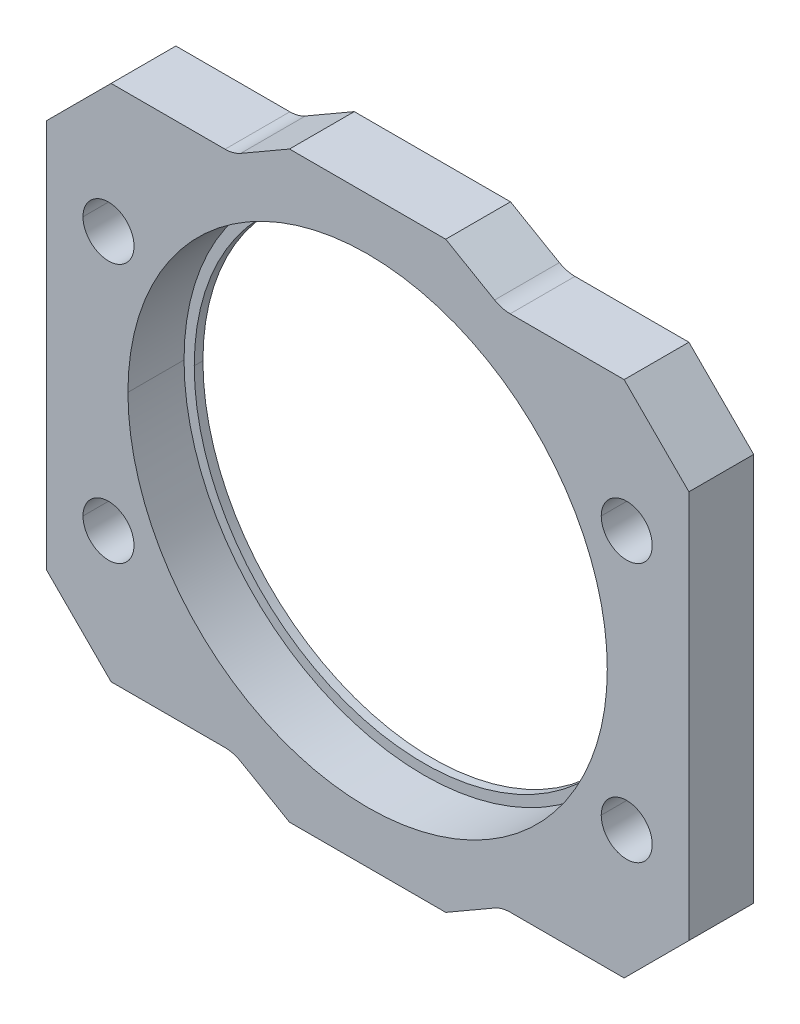
ISO-10303-21;
HEADER;
FILE_DESCRIPTION(('STEP AP214'),'2;1');
FILE_NAME('part.step','',(''),(''),'','','');
FILE_SCHEMA(('AUTOMOTIVE_DESIGN { 1 0 10303 214 1 1 1 1 }'));
ENDSEC;
DATA;
#1=APPLICATION_CONTEXT('core data for automotive mechanical design processes');
#2=APPLICATION_PROTOCOL_DEFINITION('international standard','automotive_design',2000,#1);
#3=PRODUCT_CONTEXT('',#1,'mechanical');
#4=PRODUCT('Part','Part','',(#3));
#5=PRODUCT_RELATED_PRODUCT_CATEGORY('part','',(#4));
#6=PRODUCT_DEFINITION_FORMATION('','',#4);
#7=PRODUCT_DEFINITION_CONTEXT('part definition',#1,'design');
#8=PRODUCT_DEFINITION('design','',#6,#7);
#9=PRODUCT_DEFINITION_SHAPE('','',#8);
#10=(LENGTH_UNIT() NAMED_UNIT(*) SI_UNIT(.MILLI.,.METRE.));
#11=(NAMED_UNIT(*) PLANE_ANGLE_UNIT() SI_UNIT($,.RADIAN.));
#12=(NAMED_UNIT(*) SI_UNIT($,.STERADIAN.) SOLID_ANGLE_UNIT());
#13=UNCERTAINTY_MEASURE_WITH_UNIT(LENGTH_MEASURE(1.E-05),#10,'distance_accuracy_value','');
#14=(GEOMETRIC_REPRESENTATION_CONTEXT(3) GLOBAL_UNCERTAINTY_ASSIGNED_CONTEXT((#13)) GLOBAL_UNIT_ASSIGNED_CONTEXT((#10,
#11,#12)) REPRESENTATION_CONTEXT('',''));
#15=CARTESIAN_POINT('',(0.,0.,0.));
#16=DIRECTION('',(0.,0.,1.));
#17=DIRECTION('',(1.,0.,0.));
#18=AXIS2_PLACEMENT_3D('',#15,#16,#17);
#19=CARTESIAN_POINT('',(0.,0.,-2.325));
#20=DIRECTION('',(0.,0.,-1.));
#21=DIRECTION('',(-1.,0.,0.));
#22=AXIS2_PLACEMENT_3D('',#19,#20,#21);
#23=CYLINDRICAL_SURFACE('',#22,22.495);
#24=DIRECTION('',(0.,0.,-1.));
#25=VECTOR('',#24,1.);
#26=CARTESIAN_POINT('',(22.495,0.,-2.325));
#27=LINE('',#26,#25);
#28=CARTESIAN_POINT('',(22.495,0.,-2.325));
#29=VERTEX_POINT('',#28);
#30=CARTESIAN_POINT('',(22.495,0.,-3.175));
#31=VERTEX_POINT('',#30);
#32=EDGE_CURVE('E481',#29,#31,#27,.T.);
#33=ORIENTED_EDGE('',*,*,#32,.F.);
#34=CARTESIAN_POINT('',(0.,0.,-2.325));
#35=DIRECTION('',(0.,0.,-1.));
#36=DIRECTION('',(-1.,0.,0.));
#37=AXIS2_PLACEMENT_3D('',#34,#35,#36);
#38=CIRCLE('',#37,22.495);
#39=CARTESIAN_POINT('',(-22.495,0.,-2.325));
#40=VERTEX_POINT('',#39);
#41=EDGE_CURVE('E10',#40,#29,#38,.T.);
#42=ORIENTED_EDGE('',*,*,#41,.F.);
#43=DIRECTION('',(0.,0.,-1.));
#44=VECTOR('',#43,1.);
#45=CARTESIAN_POINT('',(-22.495,0.,-2.325));
#46=LINE('',#45,#44);
#47=CARTESIAN_POINT('',(-22.495,0.,-3.175));
#48=VERTEX_POINT('',#47);
#49=EDGE_CURVE('E501',#40,#48,#46,.T.);
#50=ORIENTED_EDGE('',*,*,#49,.T.);
#51=CARTESIAN_POINT('',(0.,0.,-3.175));
#52=DIRECTION('',(0.,0.,-1.));
#53=DIRECTION('',(-1.,0.,0.));
#54=AXIS2_PLACEMENT_3D('',#51,#52,#53);
#55=CIRCLE('',#54,22.495);
#56=EDGE_CURVE('E25',#48,#31,#55,.T.);
#57=ORIENTED_EDGE('',*,*,#56,.T.);
#58=EDGE_LOOP('',(#33,#42,#50,#57));
#59=FACE_BOUND('',#58,.T.);
#60=ADVANCED_FACE('F16',(#59),#23,.F.);
#61=CARTESIAN_POINT('',(0.,0.,-2.325));
#62=DIRECTION('',(0.,0.,-1.));
#63=DIRECTION('',(0.,-1.,0.));
#64=AXIS2_PLACEMENT_3D('',#61,#62,#63);
#65=PLANE('',#64);
#66=ORIENTED_EDGE('',*,*,#41,.T.);
#67=CARTESIAN_POINT('',(0.,0.,-2.325));
#68=DIRECTION('',(0.,0.,-1.));
#69=DIRECTION('',(-1.,0.,0.));
#70=AXIS2_PLACEMENT_3D('',#67,#68,#69);
#71=CIRCLE('',#70,22.495);
#72=EDGE_CURVE('E476',#29,#40,#71,.T.);
#73=ORIENTED_EDGE('',*,*,#72,.T.);
#74=EDGE_LOOP('',(#66,#73));
#75=FACE_BOUND('',#74,.T.);
#76=CARTESIAN_POINT('',(0.,0.,-2.325));
#77=DIRECTION('',(0.,0.,-1.));
#78=DIRECTION('',(-1.,0.,0.));
#79=AXIS2_PLACEMENT_3D('',#76,#77,#78);
#80=CIRCLE('',#79,23.495);
#81=CARTESIAN_POINT('',(-23.495,0.,-2.325));
#82=VERTEX_POINT('',#81);
#83=CARTESIAN_POINT('',(23.495,0.,-2.325));
#84=VERTEX_POINT('',#83);
#85=EDGE_CURVE('E592',#82,#84,#80,.T.);
#86=ORIENTED_EDGE('',*,*,#85,.F.);
#87=CARTESIAN_POINT('',(0.,0.,-2.325));
#88=DIRECTION('',(0.,0.,-1.));
#89=DIRECTION('',(-1.,0.,0.));
#90=AXIS2_PLACEMENT_3D('',#87,#88,#89);
#91=CIRCLE('',#90,23.495);
#92=EDGE_CURVE('E583',#84,#82,#91,.T.);
#93=ORIENTED_EDGE('',*,*,#92,.F.);
#94=EDGE_LOOP('',(#86,#93));
#95=FACE_BOUND('',#94,.T.);
#96=ADVANCED_FACE('F719',(#75,#95),#65,.F.);
#97=CARTESIAN_POINT('',(-13.9731545246654,28.45,3.175));
#98=DIRECTION('',(0.,0.,1.));
#99=DIRECTION('',(1.,0.,0.));
#100=AXIS2_PLACEMENT_3D('',#97,#98,#99);
#101=CYLINDRICAL_SURFACE('',#100,3.05);
#102=CARTESIAN_POINT('',(-13.9731545246654,28.45,3.175));
#103=DIRECTION('',(0.,0.,-1.));
#104=DIRECTION('',(1.,0.,0.));
#105=AXIS2_PLACEMENT_3D('',#102,#103,#104);
#106=CIRCLE('',#105,3.05);
#107=CARTESIAN_POINT('',(-12.4481545246654,25.8086225184575,3.175));
#108=VERTEX_POINT('',#107);
#109=CARTESIAN_POINT('',(-13.9731545246654,25.4,3.175));
#110=VERTEX_POINT('',#109);
#111=EDGE_CURVE('E155',#108,#110,#106,.T.);
#112=ORIENTED_EDGE('',*,*,#111,.F.);
#113=DIRECTION('',(0.,0.,1.));
#114=VECTOR('',#113,1.);
#115=CARTESIAN_POINT('',(-12.4481545246654,25.8086225184575,3.175));
#116=LINE('',#115,#114);
#117=CARTESIAN_POINT('',(-12.4481545246654,25.8086225184575,-3.175));
#118=VERTEX_POINT('',#117);
#119=EDGE_CURVE('E249',#118,#108,#116,.T.);
#120=ORIENTED_EDGE('',*,*,#119,.F.);
#121=CARTESIAN_POINT('',(-13.9731545246654,28.45,-3.175));
#122=DIRECTION('',(0.,0.,1.));
#123=DIRECTION('',(1.,0.,0.));
#124=AXIS2_PLACEMENT_3D('',#121,#122,#123);
#125=CIRCLE('',#124,3.05);
#126=CARTESIAN_POINT('',(-13.9731545246654,25.4,-3.175));
#127=VERTEX_POINT('',#126);
#128=EDGE_CURVE('E181',#127,#118,#125,.T.);
#129=ORIENTED_EDGE('',*,*,#128,.F.);
#130=DIRECTION('',(0.,0.,-1.));
#131=VECTOR('',#130,1.);
#132=CARTESIAN_POINT('',(-13.9731545246654,25.4,-3.175));
#133=LINE('',#132,#131);
#134=EDGE_CURVE('E235',#110,#127,#133,.T.);
#135=ORIENTED_EDGE('',*,*,#134,.F.);
#136=EDGE_LOOP('',(#112,#120,#129,#135));
#137=FACE_BOUND('',#136,.T.);
#138=ADVANCED_FACE('F757',(#137),#101,.F.);
#139=CARTESIAN_POINT('',(13.9731545246655,28.45,3.175));
#140=DIRECTION('',(0.,0.,1.));
#141=DIRECTION('',(1.,0.,0.));
#142=AXIS2_PLACEMENT_3D('',#139,#140,#141);
#143=CYLINDRICAL_SURFACE('',#142,3.05);
#144=CARTESIAN_POINT('',(13.9731545246655,28.45,3.175));
#145=DIRECTION('',(0.,0.,-1.));
#146=DIRECTION('',(1.,0.,0.));
#147=AXIS2_PLACEMENT_3D('',#144,#145,#146);
#148=CIRCLE('',#147,3.05);
#149=CARTESIAN_POINT('',(13.9731545246655,25.4,3.175));
#150=VERTEX_POINT('',#149);
#151=CARTESIAN_POINT('',(12.4481545246654,25.8086225184575,3.175));
#152=VERTEX_POINT('',#151);
#153=EDGE_CURVE('E149',#150,#152,#148,.T.);
#154=ORIENTED_EDGE('',*,*,#153,.F.);
#155=DIRECTION('',(0.,0.,1.));
#156=VECTOR('',#155,1.);
#157=CARTESIAN_POINT('',(13.9731545246655,25.4,3.175));
#158=LINE('',#157,#156);
#159=CARTESIAN_POINT('',(13.9731545246655,25.4,-3.175));
#160=VERTEX_POINT('',#159);
#161=EDGE_CURVE('E337',#160,#150,#158,.T.);
#162=ORIENTED_EDGE('',*,*,#161,.F.);
#163=CARTESIAN_POINT('',(13.9731545246655,28.45,-3.175));
#164=DIRECTION('',(0.,0.,1.));
#165=DIRECTION('',(1.,0.,0.));
#166=AXIS2_PLACEMENT_3D('',#163,#164,#165);
#167=CIRCLE('',#166,3.05);
#168=CARTESIAN_POINT('',(12.4481545246654,25.8086225184575,-3.175));
#169=VERTEX_POINT('',#168);
#170=EDGE_CURVE('E164',#169,#160,#167,.T.);
#171=ORIENTED_EDGE('',*,*,#170,.F.);
#172=DIRECTION('',(0.,0.,-1.));
#173=VECTOR('',#172,1.);
#174=CARTESIAN_POINT('',(12.4481545246654,25.8086225184575,-3.175));
#175=LINE('',#174,#173);
#176=EDGE_CURVE('E356',#152,#169,#175,.T.);
#177=ORIENTED_EDGE('',*,*,#176,.F.);
#178=EDGE_LOOP('',(#154,#162,#171,#177));
#179=FACE_BOUND('',#178,.T.);
#180=ADVANCED_FACE('F762',(#179),#143,.F.);
#181=CARTESIAN_POINT('',(-13.9731545246654,-28.45,3.175));
#182=DIRECTION('',(0.,0.,1.));
#183=DIRECTION('',(1.,0.,0.));
#184=AXIS2_PLACEMENT_3D('',#181,#182,#183);
#185=CYLINDRICAL_SURFACE('',#184,3.05);
#186=CARTESIAN_POINT('',(-13.9731545246654,-28.45,3.175));
#187=DIRECTION('',(0.,0.,-1.));
#188=DIRECTION('',(1.,0.,0.));
#189=AXIS2_PLACEMENT_3D('',#186,#187,#188);
#190=CIRCLE('',#189,3.05);
#191=CARTESIAN_POINT('',(-13.9731545246654,-25.4,3.175));
#192=VERTEX_POINT('',#191);
#193=CARTESIAN_POINT('',(-12.4481545246654,-25.8086225184575,3.175));
#194=VERTEX_POINT('',#193);
#195=EDGE_CURVE('E158',#192,#194,#190,.T.);
#196=ORIENTED_EDGE('',*,*,#195,.F.);
#197=DIRECTION('',(0.,0.,1.));
#198=VECTOR('',#197,1.);
#199=CARTESIAN_POINT('',(-13.9731545246654,-25.4,3.175));
#200=LINE('',#199,#198);
#201=CARTESIAN_POINT('',(-13.9731545246654,-25.4,-3.175));
#202=VERTEX_POINT('',#201);
#203=EDGE_CURVE('E302',#202,#192,#200,.T.);
#204=ORIENTED_EDGE('',*,*,#203,.F.);
#205=CARTESIAN_POINT('',(-13.9731545246654,-28.45,-3.175));
#206=DIRECTION('',(0.,0.,1.));
#207=DIRECTION('',(1.,0.,0.));
#208=AXIS2_PLACEMENT_3D('',#205,#206,#207);
#209=CIRCLE('',#208,3.05);
#210=CARTESIAN_POINT('',(-12.4481545246654,-25.8086225184575,-3.175));
#211=VERTEX_POINT('',#210);
#212=EDGE_CURVE('E171',#211,#202,#209,.T.);
#213=ORIENTED_EDGE('',*,*,#212,.F.);
#214=DIRECTION('',(0.,0.,-1.));
#215=VECTOR('',#214,1.);
#216=CARTESIAN_POINT('',(-12.4481545246654,-25.8086225184575,-3.175));
#217=LINE('',#216,#215);
#218=EDGE_CURVE('E278',#194,#211,#217,.T.);
#219=ORIENTED_EDGE('',*,*,#218,.F.);
#220=EDGE_LOOP('',(#196,#204,#213,#219));
#221=FACE_BOUND('',#220,.T.);
#222=ADVANCED_FACE('F466',(#221),#185,.F.);
#223=CARTESIAN_POINT('',(13.9731545246654,-28.45,3.175));
#224=DIRECTION('',(0.,0.,1.));
#225=DIRECTION('',(1.,0.,0.));
#226=AXIS2_PLACEMENT_3D('',#223,#224,#225);
#227=CYLINDRICAL_SURFACE('',#226,3.05);
#228=CARTESIAN_POINT('',(13.9731545246654,-28.45,3.175));
#229=DIRECTION('',(0.,0.,-1.));
#230=DIRECTION('',(1.,0.,0.));
#231=AXIS2_PLACEMENT_3D('',#228,#229,#230);
#232=CIRCLE('',#231,3.05);
#233=CARTESIAN_POINT('',(12.4481545246654,-25.8086225184575,3.175));
#234=VERTEX_POINT('',#233);
#235=CARTESIAN_POINT('',(13.9731545246654,-25.4,3.175));
#236=VERTEX_POINT('',#235);
#237=EDGE_CURVE('E119',#234,#236,#232,.T.);
#238=ORIENTED_EDGE('',*,*,#237,.F.);
#239=DIRECTION('',(0.,0.,1.));
#240=VECTOR('',#239,1.);
#241=CARTESIAN_POINT('',(12.4481545246654,-25.8086225184575,3.175));
#242=LINE('',#241,#240);
#243=CARTESIAN_POINT('',(12.4481545246654,-25.8086225184575,-3.175));
#244=VERTEX_POINT('',#243);
#245=EDGE_CURVE('E141',#244,#234,#242,.T.);
#246=ORIENTED_EDGE('',*,*,#245,.F.);
#247=CARTESIAN_POINT('',(13.9731545246654,-28.45,-3.175));
#248=DIRECTION('',(0.,0.,1.));
#249=DIRECTION('',(1.,0.,0.));
#250=AXIS2_PLACEMENT_3D('',#247,#248,#249);
#251=CIRCLE('',#250,3.05);
#252=CARTESIAN_POINT('',(13.9731545246654,-25.4,-3.175));
#253=VERTEX_POINT('',#252);
#254=EDGE_CURVE('E175',#253,#244,#251,.T.);
#255=ORIENTED_EDGE('',*,*,#254,.F.);
#256=DIRECTION('',(0.,0.,-1.));
#257=VECTOR('',#256,1.);
#258=CARTESIAN_POINT('',(13.9731545246654,-25.4,-3.175));
#259=LINE('',#258,#257);
#260=EDGE_CURVE('E132',#236,#253,#259,.T.);
#261=ORIENTED_EDGE('',*,*,#260,.F.);
#262=EDGE_LOOP('',(#238,#246,#255,#261));
#263=FACE_BOUND('',#262,.T.);
#264=ADVANCED_FACE('F774',(#263),#227,.F.);
#265=CARTESIAN_POINT('',(-31.496,19.05,3.175));
#266=DIRECTION('',(-0.707106781186547,0.707106781186548,0.));
#267=DIRECTION('',(0.,0.,1.));
#268=AXIS2_PLACEMENT_3D('',#265,#266,#267);
#269=PLANE('',#268);
#270=DIRECTION('',(-0.707106781186548,-0.707106781186547,0.));
#271=VECTOR('',#270,1.);
#272=CARTESIAN_POINT('',(-25.273,25.273,3.175));
#273=LINE('',#272,#271);
#274=CARTESIAN_POINT('',(-25.146,25.4,3.175));
#275=VERTEX_POINT('',#274);
#276=CARTESIAN_POINT('',(-31.496,19.05,3.175));
#277=VERTEX_POINT('',#276);
#278=EDGE_CURVE('E153',#275,#277,#273,.T.);
#279=ORIENTED_EDGE('',*,*,#278,.F.);
#280=DIRECTION('',(0.,0.,1.));
#281=VECTOR('',#280,1.);
#282=CARTESIAN_POINT('',(-25.146,25.4,3.175));
#283=LINE('',#282,#281);
#284=CARTESIAN_POINT('',(-25.146,25.4,-3.175));
#285=VERTEX_POINT('',#284);
#286=EDGE_CURVE('E270',#285,#275,#283,.T.);
#287=ORIENTED_EDGE('',*,*,#286,.F.);
#288=DIRECTION('',(0.707106781186548,0.707106781186547,0.));
#289=VECTOR('',#288,1.);
#290=CARTESIAN_POINT('',(-31.496,19.05,-3.175));
#291=LINE('',#290,#289);
#292=CARTESIAN_POINT('',(-31.496,19.05,-3.175));
#293=VERTEX_POINT('',#292);
#294=EDGE_CURVE('E179',#293,#285,#291,.T.);
#295=ORIENTED_EDGE('',*,*,#294,.F.);
#296=DIRECTION('',(0.,0.,-1.));
#297=VECTOR('',#296,1.);
#298=CARTESIAN_POINT('',(-31.496,19.05,-3.175));
#299=LINE('',#298,#297);
#300=EDGE_CURVE('E291',#277,#293,#299,.T.);
#301=ORIENTED_EDGE('',*,*,#300,.F.);
#302=EDGE_LOOP('',(#279,#287,#295,#301));
#303=FACE_BOUND('',#302,.T.);
#304=ADVANCED_FACE('F769',(#303),#269,.T.);
#305=CARTESIAN_POINT('',(-25.146,-25.4,3.175));
#306=DIRECTION('',(0.707106781186549,0.707106781186547,0.));
#307=DIRECTION('',(0.,0.,-1.));
#308=AXIS2_PLACEMENT_3D('',#305,#306,#307);
#309=PLANE('',#308);
#310=DIRECTION('',(0.707106781186547,-0.707106781186549,0.));
#311=VECTOR('',#310,1.);
#312=CARTESIAN_POINT('',(-25.273,-25.273,3.175));
#313=LINE('',#312,#311);
#314=CARTESIAN_POINT('',(-31.496,-19.05,3.175));
#315=VERTEX_POINT('',#314);
#316=CARTESIAN_POINT('',(-25.146,-25.4,3.175));
#317=VERTEX_POINT('',#316);
#318=EDGE_CURVE('E156',#315,#317,#313,.T.);
#319=ORIENTED_EDGE('',*,*,#318,.F.);
#320=DIRECTION('',(0.,0.,1.));
#321=VECTOR('',#320,1.);
#322=CARTESIAN_POINT('',(-31.496,-19.05,3.175));
#323=LINE('',#322,#321);
#324=CARTESIAN_POINT('',(-31.496,-19.05,-3.175));
#325=VERTEX_POINT('',#324);
#326=EDGE_CURVE('E274',#325,#315,#323,.T.);
#327=ORIENTED_EDGE('',*,*,#326,.F.);
#328=DIRECTION('',(-0.707106781186547,0.707106781186549,0.));
#329=VECTOR('',#328,1.);
#330=CARTESIAN_POINT('',(-25.146,-25.4,-3.175));
#331=LINE('',#330,#329);
#332=CARTESIAN_POINT('',(-25.146,-25.4,-3.175));
#333=VERTEX_POINT('',#332);
#334=EDGE_CURVE('E173',#333,#325,#331,.T.);
#335=ORIENTED_EDGE('',*,*,#334,.F.);
#336=DIRECTION('',(0.,0.,-1.));
#337=VECTOR('',#336,1.);
#338=CARTESIAN_POINT('',(-25.146,-25.4,3.175));
#339=LINE('',#338,#337);
#340=EDGE_CURVE('E281',#317,#333,#339,.T.);
#341=ORIENTED_EDGE('',*,*,#340,.F.);
#342=EDGE_LOOP('',(#319,#327,#335,#341));
#343=FACE_BOUND('',#342,.T.);
#344=ADVANCED_FACE('F452',(#343),#309,.F.);
#345=CARTESIAN_POINT('',(31.496,-19.05,3.175));
#346=DIRECTION('',(0.707106781186547,-0.707106781186548,0.));
#347=DIRECTION('',(0.,0.,-1.));
#348=AXIS2_PLACEMENT_3D('',#345,#346,#347);
#349=PLANE('',#348);
#350=DIRECTION('',(0.707106781186548,0.707106781186547,0.));
#351=VECTOR('',#350,1.);
#352=CARTESIAN_POINT('',(25.273,-25.273,3.175));
#353=LINE('',#352,#351);
#354=CARTESIAN_POINT('',(25.146,-25.4,3.175));
#355=VERTEX_POINT('',#354);
#356=CARTESIAN_POINT('',(31.496,-19.05,3.175));
#357=VERTEX_POINT('',#356);
#358=EDGE_CURVE('E102',#355,#357,#353,.T.);
#359=ORIENTED_EDGE('',*,*,#358,.F.);
#360=DIRECTION('',(0.,0.,1.));
#361=VECTOR('',#360,1.);
#362=CARTESIAN_POINT('',(25.146,-25.4,3.175));
#363=LINE('',#362,#361);
#364=CARTESIAN_POINT('',(25.146,-25.4,-3.175));
#365=VERTEX_POINT('',#364);
#366=EDGE_CURVE('E110',#365,#355,#363,.T.);
#367=ORIENTED_EDGE('',*,*,#366,.F.);
#368=DIRECTION('',(-0.707106781186548,-0.707106781186547,0.));
#369=VECTOR('',#368,1.);
#370=CARTESIAN_POINT('',(31.496,-19.05,-3.175));
#371=LINE('',#370,#369);
#372=CARTESIAN_POINT('',(31.496,-19.05,-3.175));
#373=VERTEX_POINT('',#372);
#374=EDGE_CURVE('E36',#373,#365,#371,.T.);
#375=ORIENTED_EDGE('',*,*,#374,.F.);
#376=DIRECTION('',(0.,0.,-1.));
#377=VECTOR('',#376,1.);
#378=CARTESIAN_POINT('',(31.496,-19.05,-3.175));
#379=LINE('',#378,#377);
#380=EDGE_CURVE('E112',#357,#373,#379,.T.);
#381=ORIENTED_EDGE('',*,*,#380,.F.);
#382=EDGE_LOOP('',(#359,#367,#375,#381));
#383=FACE_BOUND('',#382,.T.);
#384=ADVANCED_FACE('F106',(#383),#349,.T.);
#385=CARTESIAN_POINT('',(25.146,25.4,3.175));
#386=DIRECTION('',(-0.707106781186549,-0.707106781186546,0.));
#387=DIRECTION('',(-0.707106781186546,0.707106781186549,0.));
#388=AXIS2_PLACEMENT_3D('',#385,#386,#387);
#389=PLANE('',#388);
#390=DIRECTION('',(-0.707106781186546,0.707106781186549,0.));
#391=VECTOR('',#390,1.);
#392=CARTESIAN_POINT('',(25.273,25.273,3.175));
#393=LINE('',#392,#391);
#394=CARTESIAN_POINT('',(31.496,19.05,3.175));
#395=VERTEX_POINT('',#394);
#396=CARTESIAN_POINT('',(25.146,25.4,3.175));
#397=VERTEX_POINT('',#396);
#398=EDGE_CURVE('E126',#395,#397,#393,.T.);
#399=ORIENTED_EDGE('',*,*,#398,.F.);
#400=DIRECTION('',(0.,0.,1.));
#401=VECTOR('',#400,1.);
#402=CARTESIAN_POINT('',(31.496,19.05,3.175));
#403=LINE('',#402,#401);
#404=CARTESIAN_POINT('',(31.496,19.05,-3.175));
#405=VERTEX_POINT('',#404);
#406=EDGE_CURVE('E327',#405,#395,#403,.T.);
#407=ORIENTED_EDGE('',*,*,#406,.F.);
#408=DIRECTION('',(0.707106781186546,-0.707106781186549,0.));
#409=VECTOR('',#408,1.);
#410=CARTESIAN_POINT('',(25.146,25.4,-3.175));
#411=LINE('',#410,#409);
#412=CARTESIAN_POINT('',(25.146,25.4,-3.175));
#413=VERTEX_POINT('',#412);
#414=EDGE_CURVE('E166',#413,#405,#411,.T.);
#415=ORIENTED_EDGE('',*,*,#414,.F.);
#416=DIRECTION('',(0.,0.,-1.));
#417=VECTOR('',#416,1.);
#418=CARTESIAN_POINT('',(25.146,25.4,3.175));
#419=LINE('',#418,#417);
#420=EDGE_CURVE('E347',#397,#413,#419,.T.);
#421=ORIENTED_EDGE('',*,*,#420,.F.);
#422=EDGE_LOOP('',(#399,#407,#415,#421));
#423=FACE_BOUND('',#422,.T.);
#424=ADVANCED_FACE('F614',(#423),#389,.F.);
#425=CARTESIAN_POINT('',(25.4,-12.7,3.175));
#426=DIRECTION('',(0.,0.,1.));
#427=DIRECTION('',(1.,0.,0.));
#428=AXIS2_PLACEMENT_3D('',#425,#426,#427);
#429=CYLINDRICAL_SURFACE('',#428,2.5);
#430=DIRECTION('',(0.,0.,1.));
#431=VECTOR('',#430,1.);
#432=CARTESIAN_POINT('',(22.9,-12.7,3.175));
#433=LINE('',#432,#431);
#434=CARTESIAN_POINT('',(22.9,-12.7,-3.175));
#435=VERTEX_POINT('',#434);
#436=CARTESIAN_POINT('',(22.9,-12.7,3.175));
#437=VERTEX_POINT('',#436);
#438=EDGE_CURVE('E523',#435,#437,#433,.T.);
#439=ORIENTED_EDGE('',*,*,#438,.F.);
#440=CARTESIAN_POINT('',(25.4,-12.7,-3.175));
#441=DIRECTION('',(0.,0.,1.));
#442=DIRECTION('',(1.,0.,0.));
#443=AXIS2_PLACEMENT_3D('',#440,#441,#442);
#444=CIRCLE('',#443,2.5);
#445=CARTESIAN_POINT('',(27.9,-12.7,-3.175));
#446=VERTEX_POINT('',#445);
#447=EDGE_CURVE('E183',#446,#435,#444,.T.);
#448=ORIENTED_EDGE('',*,*,#447,.F.);
#449=DIRECTION('',(0.,0.,1.));
#450=VECTOR('',#449,1.);
#451=CARTESIAN_POINT('',(27.9,-12.7,3.175));
#452=LINE('',#451,#450);
#453=CARTESIAN_POINT('',(27.9,-12.7,3.175));
#454=VERTEX_POINT('',#453);
#455=EDGE_CURVE('E541',#446,#454,#452,.T.);
#456=ORIENTED_EDGE('',*,*,#455,.T.);
#457=CARTESIAN_POINT('',(25.4,-12.7,3.175));
#458=DIRECTION('',(0.,0.,1.));
#459=DIRECTION('',(1.,0.,0.));
#460=AXIS2_PLACEMENT_3D('',#457,#458,#459);
#461=CIRCLE('',#460,2.5);
#462=EDGE_CURVE('E117',#454,#437,#461,.T.);
#463=ORIENTED_EDGE('',*,*,#462,.T.);
#464=EDGE_LOOP('',(#439,#448,#456,#463));
#465=FACE_BOUND('',#464,.T.);
#466=ADVANCED_FACE('F740',(#465),#429,.F.);
#467=CARTESIAN_POINT('',(-25.4,12.7,3.175));
#468=DIRECTION('',(0.,0.,1.));
#469=DIRECTION('',(1.,0.,0.));
#470=AXIS2_PLACEMENT_3D('',#467,#468,#469);
#471=CYLINDRICAL_SURFACE('',#470,2.5);
#472=DIRECTION('',(0.,0.,1.));
#473=VECTOR('',#472,1.);
#474=CARTESIAN_POINT('',(-27.9,12.7,3.175));
#475=LINE('',#474,#473);
#476=CARTESIAN_POINT('',(-27.9,12.7,-3.175));
#477=VERTEX_POINT('',#476);
#478=CARTESIAN_POINT('',(-27.9,12.7,3.175));
#479=VERTEX_POINT('',#478);
#480=EDGE_CURVE('E513',#477,#479,#475,.T.);
#481=ORIENTED_EDGE('',*,*,#480,.F.);
#482=CARTESIAN_POINT('',(-25.4,12.7,-3.175));
#483=DIRECTION('',(0.,0.,1.));
#484=DIRECTION('',(1.,0.,0.));
#485=AXIS2_PLACEMENT_3D('',#482,#483,#484);
#486=CIRCLE('',#485,2.5);
#487=CARTESIAN_POINT('',(-22.9,12.7,-3.175));
#488=VERTEX_POINT('',#487);
#489=EDGE_CURVE('E186',#488,#477,#486,.T.);
#490=ORIENTED_EDGE('',*,*,#489,.F.);
#491=DIRECTION('',(0.,0.,1.));
#492=VECTOR('',#491,1.);
#493=CARTESIAN_POINT('',(-22.9,12.7,3.175));
#494=LINE('',#493,#492);
#495=CARTESIAN_POINT('',(-22.9,12.7,3.175));
#496=VERTEX_POINT('',#495);
#497=EDGE_CURVE('E494',#488,#496,#494,.T.);
#498=ORIENTED_EDGE('',*,*,#497,.T.);
#499=CARTESIAN_POINT('',(-25.4,12.7,3.175));
#500=DIRECTION('',(0.,0.,1.));
#501=DIRECTION('',(1.,0.,0.));
#502=AXIS2_PLACEMENT_3D('',#499,#500,#501);
#503=CIRCLE('',#502,2.5);
#504=EDGE_CURVE('E159',#496,#479,#503,.T.);
#505=ORIENTED_EDGE('',*,*,#504,.T.);
#506=EDGE_LOOP('',(#481,#490,#498,#505));
#507=FACE_BOUND('',#506,.T.);
#508=ADVANCED_FACE('F778',(#507),#471,.F.);
#509=CARTESIAN_POINT('',(-25.4,-12.7,3.175));
#510=DIRECTION('',(0.,0.,1.));
#511=DIRECTION('',(1.,0.,0.));
#512=AXIS2_PLACEMENT_3D('',#509,#510,#511);
#513=CYLINDRICAL_SURFACE('',#512,2.5);
#514=DIRECTION('',(0.,0.,1.));
#515=VECTOR('',#514,1.);
#516=CARTESIAN_POINT('',(-27.9,-12.7,3.175));
#517=LINE('',#516,#515);
#518=CARTESIAN_POINT('',(-27.9,-12.7,-3.175));
#519=VERTEX_POINT('',#518);
#520=CARTESIAN_POINT('',(-27.9,-12.7,3.175));
#521=VERTEX_POINT('',#520);
#522=EDGE_CURVE('E491',#519,#521,#517,.T.);
#523=ORIENTED_EDGE('',*,*,#522,.F.);
#524=CARTESIAN_POINT('',(-25.4,-12.7,-3.175));
#525=DIRECTION('',(0.,0.,1.));
#526=DIRECTION('',(1.,0.,0.));
#527=AXIS2_PLACEMENT_3D('',#524,#525,#526);
#528=CIRCLE('',#527,2.5);
#529=CARTESIAN_POINT('',(-22.9,-12.7,-3.175));
#530=VERTEX_POINT('',#529);
#531=EDGE_CURVE('E189',#530,#519,#528,.T.);
#532=ORIENTED_EDGE('',*,*,#531,.F.);
#533=DIRECTION('',(0.,0.,1.));
#534=VECTOR('',#533,1.);
#535=CARTESIAN_POINT('',(-22.9,-12.7,3.175));
#536=LINE('',#535,#534);
#537=CARTESIAN_POINT('',(-22.9,-12.7,3.175));
#538=VERTEX_POINT('',#537);
#539=EDGE_CURVE('E489',#530,#538,#536,.T.);
#540=ORIENTED_EDGE('',*,*,#539,.T.);
#541=CARTESIAN_POINT('',(-25.4,-12.7,3.175));
#542=DIRECTION('',(0.,0.,1.));
#543=DIRECTION('',(1.,0.,0.));
#544=AXIS2_PLACEMENT_3D('',#541,#542,#543);
#545=CIRCLE('',#544,2.5);
#546=EDGE_CURVE('E163',#538,#521,#545,.T.);
#547=ORIENTED_EDGE('',*,*,#546,.T.);
#548=EDGE_LOOP('',(#523,#532,#540,#547));
#549=FACE_BOUND('',#548,.T.);
#550=ADVANCED_FACE('F780',(#549),#513,.F.);
#551=CARTESIAN_POINT('',(25.4,12.7,3.175));
#552=DIRECTION('',(0.,0.,1.));
#553=DIRECTION('',(1.,0.,0.));
#554=AXIS2_PLACEMENT_3D('',#551,#552,#553);
#555=CYLINDRICAL_SURFACE('',#554,2.5);
#556=DIRECTION('',(0.,0.,1.));
#557=VECTOR('',#556,1.);
#558=CARTESIAN_POINT('',(22.9,12.7,3.175));
#559=LINE('',#558,#557);
#560=CARTESIAN_POINT('',(22.9,12.7,-3.175));
#561=VERTEX_POINT('',#560);
#562=CARTESIAN_POINT('',(22.9,12.7,3.175));
#563=VERTEX_POINT('',#562);
#564=EDGE_CURVE('E558',#561,#563,#559,.T.);
#565=ORIENTED_EDGE('',*,*,#564,.F.);
#566=CARTESIAN_POINT('',(25.4,12.7,-3.175));
#567=DIRECTION('',(0.,0.,1.));
#568=DIRECTION('',(1.,0.,0.));
#569=AXIS2_PLACEMENT_3D('',#566,#567,#568);
#570=CIRCLE('',#569,2.5);
#571=CARTESIAN_POINT('',(27.9,12.7,-3.175));
#572=VERTEX_POINT('',#571);
#573=EDGE_CURVE('E190',#572,#561,#570,.T.);
#574=ORIENTED_EDGE('',*,*,#573,.F.);
#575=DIRECTION('',(0.,0.,1.));
#576=VECTOR('',#575,1.);
#577=CARTESIAN_POINT('',(27.9,12.7,3.175));
#578=LINE('',#577,#576);
#579=CARTESIAN_POINT('',(27.9,12.7,3.175));
#580=VERTEX_POINT('',#579);
#581=EDGE_CURVE('E567',#572,#580,#578,.T.);
#582=ORIENTED_EDGE('',*,*,#581,.T.);
#583=CARTESIAN_POINT('',(25.4,12.7,3.175));
#584=DIRECTION('',(0.,0.,1.));
#585=DIRECTION('',(1.,0.,0.));
#586=AXIS2_PLACEMENT_3D('',#583,#584,#585);
#587=CIRCLE('',#586,2.5);
#588=EDGE_CURVE('E168',#580,#563,#587,.T.);
#589=ORIENTED_EDGE('',*,*,#588,.T.);
#590=EDGE_LOOP('',(#565,#574,#582,#589));
#591=FACE_BOUND('',#590,.T.);
#592=ADVANCED_FACE('F729',(#591),#555,.F.);
#593=CARTESIAN_POINT('',(0.,0.,-3.175));
#594=DIRECTION('',(0.,0.,1.));
#595=DIRECTION('',(1.,0.,0.));
#596=AXIS2_PLACEMENT_3D('',#593,#594,#595);
#597=PLANE('',#596);
#598=ORIENTED_EDGE('',*,*,#56,.F.);
#599=CARTESIAN_POINT('',(0.,0.,-3.175));
#600=DIRECTION('',(0.,0.,-1.));
#601=DIRECTION('',(-1.,0.,0.));
#602=AXIS2_PLACEMENT_3D('',#599,#600,#601);
#603=CIRCLE('',#602,22.495);
#604=EDGE_CURVE('E484',#31,#48,#603,.T.);
#605=ORIENTED_EDGE('',*,*,#604,.F.);
#606=EDGE_LOOP('',(#598,#605));
#607=FACE_BOUND('',#606,.T.);
#608=ORIENTED_EDGE('',*,*,#573,.T.);
#609=CARTESIAN_POINT('',(25.4,12.7,-3.175));
#610=DIRECTION('',(0.,0.,1.));
#611=DIRECTION('',(1.,0.,0.));
#612=AXIS2_PLACEMENT_3D('',#609,#610,#611);
#613=CIRCLE('',#612,2.5);
#614=EDGE_CURVE('E508',#561,#572,#613,.T.);
#615=ORIENTED_EDGE('',*,*,#614,.T.);
#616=EDGE_LOOP('',(#608,#615));
#617=FACE_BOUND('',#616,.T.);
#618=ORIENTED_EDGE('',*,*,#531,.T.);
#619=CARTESIAN_POINT('',(-25.4,-12.7,-3.175));
#620=DIRECTION('',(0.,0.,1.));
#621=DIRECTION('',(1.,0.,0.));
#622=AXIS2_PLACEMENT_3D('',#619,#620,#621);
#623=CIRCLE('',#622,2.5);
#624=EDGE_CURVE('E495',#519,#530,#623,.T.);
#625=ORIENTED_EDGE('',*,*,#624,.T.);
#626=EDGE_LOOP('',(#618,#625));
#627=FACE_BOUND('',#626,.T.);
#628=ORIENTED_EDGE('',*,*,#489,.T.);
#629=CARTESIAN_POINT('',(-25.4,12.7,-3.175));
#630=DIRECTION('',(0.,0.,1.));
#631=DIRECTION('',(1.,0.,0.));
#632=AXIS2_PLACEMENT_3D('',#629,#630,#631);
#633=CIRCLE('',#632,2.5);
#634=EDGE_CURVE('E517',#477,#488,#633,.T.);
#635=ORIENTED_EDGE('',*,*,#634,.T.);
#636=EDGE_LOOP('',(#628,#635));
#637=FACE_BOUND('',#636,.T.);
#638=ORIENTED_EDGE('',*,*,#447,.T.);
#639=CARTESIAN_POINT('',(25.4,-12.7,-3.175));
#640=DIRECTION('',(0.,0.,1.));
#641=DIRECTION('',(1.,0.,0.));
#642=AXIS2_PLACEMENT_3D('',#639,#640,#641);
#643=CIRCLE('',#642,2.5);
#644=EDGE_CURVE('E525',#435,#446,#643,.T.);
#645=ORIENTED_EDGE('',*,*,#644,.T.);
#646=EDGE_LOOP('',(#638,#645));
#647=FACE_BOUND('',#646,.T.);
#648=DIRECTION('',(0.866025403784438,-0.5,0.));
#649=VECTOR('',#648,1.);
#650=CARTESIAN_POINT('',(14.2875,24.7466759131403,-3.175));
#651=LINE('',#650,#649);
#652=CARTESIAN_POINT('',(7.65664817371935,28.575,-3.175));
#653=VERTEX_POINT('',#652);
#654=EDGE_CURVE('E217',#653,#169,#651,.T.);
#655=ORIENTED_EDGE('',*,*,#654,.T.);
#656=ORIENTED_EDGE('',*,*,#170,.T.);
#657=DIRECTION('',(1.,0.,0.));
#658=VECTOR('',#657,1.);
#659=CARTESIAN_POINT('',(0.,25.4,-3.175));
#660=LINE('',#659,#658);
#661=EDGE_CURVE('E331',#160,#413,#660,.T.);
#662=ORIENTED_EDGE('',*,*,#661,.T.);
#663=ORIENTED_EDGE('',*,*,#414,.T.);
#664=DIRECTION('',(0.,-1.,0.));
#665=VECTOR('',#664,1.);
#666=CARTESIAN_POINT('',(31.496,0.,-3.175));
#667=LINE('',#666,#665);
#668=EDGE_CURVE('E598',#405,#373,#667,.T.);
#669=ORIENTED_EDGE('',*,*,#668,.T.);
#670=ORIENTED_EDGE('',*,*,#374,.T.);
#671=DIRECTION('',(1.,0.,0.));
#672=VECTOR('',#671,1.);
#673=CARTESIAN_POINT('',(0.,-25.4,-3.175));
#674=LINE('',#673,#672);
#675=EDGE_CURVE('E123',#253,#365,#674,.T.);
#676=ORIENTED_EDGE('',*,*,#675,.F.);
#677=ORIENTED_EDGE('',*,*,#254,.T.);
#678=DIRECTION('',(0.866025403784438,0.5,0.));
#679=VECTOR('',#678,1.);
#680=CARTESIAN_POINT('',(14.2875,-24.7466759131403,-3.175));
#681=LINE('',#680,#679);
#682=CARTESIAN_POINT('',(7.65664817371936,-28.575,-3.175));
#683=VERTEX_POINT('',#682);
#684=EDGE_CURVE('E296',#683,#244,#681,.T.);
#685=ORIENTED_EDGE('',*,*,#684,.F.);
#686=DIRECTION('',(1.,0.,0.));
#687=VECTOR('',#686,1.);
#688=CARTESIAN_POINT('',(0.,-28.575,-3.175));
#689=LINE('',#688,#687);
#690=CARTESIAN_POINT('',(-7.65664817371934,-28.575,-3.175));
#691=VERTEX_POINT('',#690);
#692=EDGE_CURVE('E306',#691,#683,#689,.T.);
#693=ORIENTED_EDGE('',*,*,#692,.F.);
#694=DIRECTION('',(0.866025403784438,-0.5,0.));
#695=VECTOR('',#694,1.);
#696=CARTESIAN_POINT('',(-14.2875,-24.7466759131403,-3.175));
#697=LINE('',#696,#695);
#698=EDGE_CURVE('E324',#211,#691,#697,.T.);
#699=ORIENTED_EDGE('',*,*,#698,.F.);
#700=ORIENTED_EDGE('',*,*,#212,.T.);
#701=DIRECTION('',(1.,0.,0.));
#702=VECTOR('',#701,1.);
#703=CARTESIAN_POINT('',(0.,-25.4,-3.175));
#704=LINE('',#703,#702);
#705=EDGE_CURVE('E300',#333,#202,#704,.T.);
#706=ORIENTED_EDGE('',*,*,#705,.F.);
#707=ORIENTED_EDGE('',*,*,#334,.T.);
#708=DIRECTION('',(0.,-1.,0.));
#709=VECTOR('',#708,1.);
#710=CARTESIAN_POINT('',(-31.496,0.,-3.175));
#711=LINE('',#710,#709);
#712=EDGE_CURVE('E271',#293,#325,#711,.T.);
#713=ORIENTED_EDGE('',*,*,#712,.F.);
#714=ORIENTED_EDGE('',*,*,#294,.T.);
#715=DIRECTION('',(1.,0.,0.));
#716=VECTOR('',#715,1.);
#717=CARTESIAN_POINT('',(0.,25.4,-3.175));
#718=LINE('',#717,#716);
#719=EDGE_CURVE('E240',#285,#127,#718,.T.);
#720=ORIENTED_EDGE('',*,*,#719,.T.);
#721=ORIENTED_EDGE('',*,*,#128,.T.);
#722=DIRECTION('',(0.866025403784438,0.5,0.));
#723=VECTOR('',#722,1.);
#724=CARTESIAN_POINT('',(-14.2875,24.7466759131403,-3.175));
#725=LINE('',#724,#723);
#726=CARTESIAN_POINT('',(-7.65664817371935,28.575,-3.175));
#727=VERTEX_POINT('',#726);
#728=EDGE_CURVE('E241',#118,#727,#725,.T.);
#729=ORIENTED_EDGE('',*,*,#728,.T.);
#730=DIRECTION('',(1.,0.,0.));
#731=VECTOR('',#730,1.);
#732=CARTESIAN_POINT('',(0.,28.575,-3.175));
#733=LINE('',#732,#731);
#734=EDGE_CURVE('E225',#727,#653,#733,.T.);
#735=ORIENTED_EDGE('',*,*,#734,.T.);
#736=EDGE_LOOP('',(#655,#656,#662,#663,#669,#670,#676,#677,#685,#693,#699,#700,#706,#707,#713,
#714,#720,#721,#729,#735));
#737=FACE_BOUND('',#736,.T.);
#738=ADVANCED_FACE('F371',(#607,#617,#627,#637,#647,#737),#597,.F.);
#739=CARTESIAN_POINT('',(0.,0.,3.175));
#740=DIRECTION('',(0.,0.,1.));
#741=DIRECTION('',(1.,0.,0.));
#742=AXIS2_PLACEMENT_3D('',#739,#740,#741);
#743=PLANE('',#742);
#744=CARTESIAN_POINT('',(0.,0.,3.175));
#745=DIRECTION('',(0.,0.,1.));
#746=DIRECTION('',(1.,0.,0.));
#747=AXIS2_PLACEMENT_3D('',#744,#745,#746);
#748=CIRCLE('',#747,23.495);
#749=CARTESIAN_POINT('',(-23.495,0.,3.175));
#750=VERTEX_POINT('',#749);
#751=CARTESIAN_POINT('',(23.495,0.,3.175));
#752=VERTEX_POINT('',#751);
#753=EDGE_CURVE('E572',#750,#752,#748,.T.);
#754=ORIENTED_EDGE('',*,*,#753,.F.);
#755=CARTESIAN_POINT('',(0.,0.,3.175));
#756=DIRECTION('',(0.,0.,1.));
#757=DIRECTION('',(1.,0.,0.));
#758=AXIS2_PLACEMENT_3D('',#755,#756,#757);
#759=CIRCLE('',#758,23.495);
#760=EDGE_CURVE('E589',#752,#750,#759,.T.);
#761=ORIENTED_EDGE('',*,*,#760,.F.);
#762=EDGE_LOOP('',(#754,#761));
#763=FACE_BOUND('',#762,.T.);
#764=ORIENTED_EDGE('',*,*,#588,.F.);
#765=CARTESIAN_POINT('',(25.4,12.7,3.175));
#766=DIRECTION('',(0.,0.,1.));
#767=DIRECTION('',(1.,0.,0.));
#768=AXIS2_PLACEMENT_3D('',#765,#766,#767);
#769=CIRCLE('',#768,2.5);
#770=EDGE_CURVE('E564',#563,#580,#769,.T.);
#771=ORIENTED_EDGE('',*,*,#770,.F.);
#772=EDGE_LOOP('',(#764,#771));
#773=FACE_BOUND('',#772,.T.);
#774=ORIENTED_EDGE('',*,*,#546,.F.);
#775=CARTESIAN_POINT('',(-25.4,-12.7,3.175));
#776=DIRECTION('',(0.,0.,1.));
#777=DIRECTION('',(1.,0.,0.));
#778=AXIS2_PLACEMENT_3D('',#775,#776,#777);
#779=CIRCLE('',#778,2.5);
#780=EDGE_CURVE('E486',#521,#538,#779,.T.);
#781=ORIENTED_EDGE('',*,*,#780,.F.);
#782=EDGE_LOOP('',(#774,#781));
#783=FACE_BOUND('',#782,.T.);
#784=ORIENTED_EDGE('',*,*,#504,.F.);
#785=CARTESIAN_POINT('',(-25.4,12.7,3.175));
#786=DIRECTION('',(0.,0.,1.));
#787=DIRECTION('',(1.,0.,0.));
#788=AXIS2_PLACEMENT_3D('',#785,#786,#787);
#789=CIRCLE('',#788,2.5);
#790=EDGE_CURVE('E520',#479,#496,#789,.T.);
#791=ORIENTED_EDGE('',*,*,#790,.F.);
#792=EDGE_LOOP('',(#784,#791));
#793=FACE_BOUND('',#792,.T.);
#794=ORIENTED_EDGE('',*,*,#462,.F.);
#795=CARTESIAN_POINT('',(25.4,-12.7,3.175));
#796=DIRECTION('',(0.,0.,1.));
#797=DIRECTION('',(1.,0.,0.));
#798=AXIS2_PLACEMENT_3D('',#795,#796,#797);
#799=CIRCLE('',#798,2.5);
#800=EDGE_CURVE('E529',#437,#454,#799,.T.);
#801=ORIENTED_EDGE('',*,*,#800,.F.);
#802=EDGE_LOOP('',(#794,#801));
#803=FACE_BOUND('',#802,.T.);
#804=DIRECTION('',(0.,-1.,0.));
#805=VECTOR('',#804,1.);
#806=CARTESIAN_POINT('',(31.496,0.,3.175));
#807=LINE('',#806,#805);
#808=EDGE_CURVE('E332',#395,#357,#807,.T.);
#809=ORIENTED_EDGE('',*,*,#808,.F.);
#810=ORIENTED_EDGE('',*,*,#398,.T.);
#811=DIRECTION('',(1.,0.,0.));
#812=VECTOR('',#811,1.);
#813=CARTESIAN_POINT('',(0.,25.4,3.175));
#814=LINE('',#813,#812);
#815=EDGE_CURVE('E345',#150,#397,#814,.T.);
#816=ORIENTED_EDGE('',*,*,#815,.F.);
#817=ORIENTED_EDGE('',*,*,#153,.T.);
#818=DIRECTION('',(0.866025403784438,-0.5,0.));
#819=VECTOR('',#818,1.);
#820=CARTESIAN_POINT('',(14.2875,24.7466759131403,3.175));
#821=LINE('',#820,#819);
#822=CARTESIAN_POINT('',(7.65664817371935,28.575,3.175));
#823=VERTEX_POINT('',#822);
#824=EDGE_CURVE('E352',#823,#152,#821,.T.);
#825=ORIENTED_EDGE('',*,*,#824,.F.);
#826=DIRECTION('',(1.,0.,0.));
#827=VECTOR('',#826,1.);
#828=CARTESIAN_POINT('',(0.,28.575,3.175));
#829=LINE('',#828,#827);
#830=CARTESIAN_POINT('',(-7.65664817371935,28.575,3.175));
#831=VERTEX_POINT('',#830);
#832=EDGE_CURVE('E232',#831,#823,#829,.T.);
#833=ORIENTED_EDGE('',*,*,#832,.F.);
#834=DIRECTION('',(0.866025403784438,0.5,0.));
#835=VECTOR('',#834,1.);
#836=CARTESIAN_POINT('',(-14.2875,24.7466759131403,3.175));
#837=LINE('',#836,#835);
#838=EDGE_CURVE('E260',#108,#831,#837,.T.);
#839=ORIENTED_EDGE('',*,*,#838,.F.);
#840=ORIENTED_EDGE('',*,*,#111,.T.);
#841=DIRECTION('',(1.,0.,0.));
#842=VECTOR('',#841,1.);
#843=CARTESIAN_POINT('',(0.,25.4,3.175));
#844=LINE('',#843,#842);
#845=EDGE_CURVE('E236',#275,#110,#844,.T.);
#846=ORIENTED_EDGE('',*,*,#845,.F.);
#847=ORIENTED_EDGE('',*,*,#278,.T.);
#848=DIRECTION('',(0.,-1.,0.));
#849=VECTOR('',#848,1.);
#850=CARTESIAN_POINT('',(-31.496,0.,3.175));
#851=LINE('',#850,#849);
#852=EDGE_CURVE('E283',#277,#315,#851,.T.);
#853=ORIENTED_EDGE('',*,*,#852,.T.);
#854=ORIENTED_EDGE('',*,*,#318,.T.);
#855=DIRECTION('',(1.,0.,0.));
#856=VECTOR('',#855,1.);
#857=CARTESIAN_POINT('',(0.,-25.4,3.175));
#858=LINE('',#857,#856);
#859=EDGE_CURVE('E305',#317,#192,#858,.T.);
#860=ORIENTED_EDGE('',*,*,#859,.T.);
#861=ORIENTED_EDGE('',*,*,#195,.T.);
#862=DIRECTION('',(0.866025403784438,-0.5,0.));
#863=VECTOR('',#862,1.);
#864=CARTESIAN_POINT('',(-14.2875,-24.7466759131403,3.175));
#865=LINE('',#864,#863);
#866=CARTESIAN_POINT('',(-7.65664817371934,-28.575,3.175));
#867=VERTEX_POINT('',#866);
#868=EDGE_CURVE('E277',#194,#867,#865,.T.);
#869=ORIENTED_EDGE('',*,*,#868,.T.);
#870=DIRECTION('',(1.,0.,0.));
#871=VECTOR('',#870,1.);
#872=CARTESIAN_POINT('',(0.,-28.575,3.175));
#873=LINE('',#872,#871);
#874=CARTESIAN_POINT('',(7.65664817371936,-28.575,3.175));
#875=VERTEX_POINT('',#874);
#876=EDGE_CURVE('E150',#867,#875,#873,.T.);
#877=ORIENTED_EDGE('',*,*,#876,.T.);
#878=DIRECTION('',(0.866025403784438,0.5,0.));
#879=VECTOR('',#878,1.);
#880=CARTESIAN_POINT('',(14.2875,-24.7466759131403,3.175));
#881=LINE('',#880,#879);
#882=EDGE_CURVE('E133',#875,#234,#881,.T.);
#883=ORIENTED_EDGE('',*,*,#882,.T.);
#884=ORIENTED_EDGE('',*,*,#237,.T.);
#885=DIRECTION('',(1.,0.,0.));
#886=VECTOR('',#885,1.);
#887=CARTESIAN_POINT('',(0.,-25.4,3.175));
#888=LINE('',#887,#886);
#889=EDGE_CURVE('E121',#236,#355,#888,.T.);
#890=ORIENTED_EDGE('',*,*,#889,.T.);
#891=ORIENTED_EDGE('',*,*,#358,.T.);
#892=EDGE_LOOP('',(#809,#810,#816,#817,#825,#833,#839,#840,#846,#847,#853,#854,#860,#861,#869,
#877,#883,#884,#890,#891));
#893=FACE_BOUND('',#892,.T.);
#894=ADVANCED_FACE('F127',(#763,#773,#783,#793,#803,#893),#743,.T.);
#895=CARTESIAN_POINT('',(0.,-25.4,3.175));
#896=DIRECTION('',(0.,1.,0.));
#897=DIRECTION('',(1.,0.,0.));
#898=AXIS2_PLACEMENT_3D('',#895,#896,#897);
#899=PLANE('',#898);
#900=ORIENTED_EDGE('',*,*,#889,.F.);
#901=ORIENTED_EDGE('',*,*,#260,.T.);
#902=ORIENTED_EDGE('',*,*,#675,.T.);
#903=ORIENTED_EDGE('',*,*,#366,.T.);
#904=EDGE_LOOP('',(#900,#901,#902,#903));
#905=FACE_BOUND('',#904,.T.);
#906=ADVANCED_FACE('F125',(#905),#899,.F.);
#907=CARTESIAN_POINT('',(14.2875,-24.7466759131403,3.175));
#908=DIRECTION('',(-0.5,0.866025403784438,0.));
#909=DIRECTION('',(0.,0.,1.));
#910=AXIS2_PLACEMENT_3D('',#907,#908,#909);
#911=PLANE('',#910);
#912=ORIENTED_EDGE('',*,*,#684,.T.);
#913=ORIENTED_EDGE('',*,*,#245,.T.);
#914=ORIENTED_EDGE('',*,*,#882,.F.);
#915=DIRECTION('',(0.,0.,-1.));
#916=VECTOR('',#915,1.);
#917=CARTESIAN_POINT('',(7.65664817371936,-28.575,3.175));
#918=LINE('',#917,#916);
#919=EDGE_CURVE('E303',#875,#683,#918,.T.);
#920=ORIENTED_EDGE('',*,*,#919,.T.);
#921=EDGE_LOOP('',(#912,#913,#914,#920));
#922=FACE_BOUND('',#921,.T.);
#923=ADVANCED_FACE('F749',(#922),#911,.F.);
#924=CARTESIAN_POINT('',(0.,-28.575,3.175));
#925=DIRECTION('',(0.,1.,0.));
#926=DIRECTION('',(1.,0.,0.));
#927=AXIS2_PLACEMENT_3D('',#924,#925,#926);
#928=PLANE('',#927);
#929=ORIENTED_EDGE('',*,*,#692,.T.);
#930=ORIENTED_EDGE('',*,*,#919,.F.);
#931=ORIENTED_EDGE('',*,*,#876,.F.);
#932=DIRECTION('',(0.,0.,-1.));
#933=VECTOR('',#932,1.);
#934=CARTESIAN_POINT('',(-7.65664817371934,-28.575,3.175));
#935=LINE('',#934,#933);
#936=EDGE_CURVE('E320',#867,#691,#935,.T.);
#937=ORIENTED_EDGE('',*,*,#936,.T.);
#938=EDGE_LOOP('',(#929,#930,#931,#937));
#939=FACE_BOUND('',#938,.T.);
#940=ADVANCED_FACE('F855',(#939),#928,.F.);
#941=CARTESIAN_POINT('',(-14.2875,-24.7466759131403,3.175));
#942=DIRECTION('',(0.5,0.866025403784438,0.));
#943=DIRECTION('',(0.,0.,-1.));
#944=AXIS2_PLACEMENT_3D('',#941,#942,#943);
#945=PLANE('',#944);
#946=ORIENTED_EDGE('',*,*,#868,.F.);
#947=ORIENTED_EDGE('',*,*,#218,.T.);
#948=ORIENTED_EDGE('',*,*,#698,.T.);
#949=ORIENTED_EDGE('',*,*,#936,.F.);
#950=EDGE_LOOP('',(#946,#947,#948,#949));
#951=FACE_BOUND('',#950,.T.);
#952=ADVANCED_FACE('F848',(#951),#945,.F.);
#953=CARTESIAN_POINT('',(0.,-25.4,3.175));
#954=DIRECTION('',(0.,1.,0.));
#955=DIRECTION('',(1.,0.,0.));
#956=AXIS2_PLACEMENT_3D('',#953,#954,#955);
#957=PLANE('',#956);
#958=ORIENTED_EDGE('',*,*,#705,.T.);
#959=ORIENTED_EDGE('',*,*,#203,.T.);
#960=ORIENTED_EDGE('',*,*,#859,.F.);
#961=ORIENTED_EDGE('',*,*,#340,.T.);
#962=EDGE_LOOP('',(#958,#959,#960,#961));
#963=FACE_BOUND('',#962,.T.);
#964=ADVANCED_FACE('F456',(#963),#957,.F.);
#965=CARTESIAN_POINT('',(-31.496,0.,3.175));
#966=DIRECTION('',(1.,0.,0.));
#967=DIRECTION('',(0.,1.,0.));
#968=AXIS2_PLACEMENT_3D('',#965,#966,#967);
#969=PLANE('',#968);
#970=ORIENTED_EDGE('',*,*,#712,.T.);
#971=ORIENTED_EDGE('',*,*,#326,.T.);
#972=ORIENTED_EDGE('',*,*,#852,.F.);
#973=ORIENTED_EDGE('',*,*,#300,.T.);
#974=EDGE_LOOP('',(#970,#971,#972,#973));
#975=FACE_BOUND('',#974,.T.);
#976=ADVANCED_FACE('F840',(#975),#969,.F.);
#977=CARTESIAN_POINT('',(0.,25.4,3.175));
#978=DIRECTION('',(0.,1.,0.));
#979=DIRECTION('',(1.,0.,0.));
#980=AXIS2_PLACEMENT_3D('',#977,#978,#979);
#981=PLANE('',#980);
#982=ORIENTED_EDGE('',*,*,#845,.T.);
#983=ORIENTED_EDGE('',*,*,#134,.T.);
#984=ORIENTED_EDGE('',*,*,#719,.F.);
#985=ORIENTED_EDGE('',*,*,#286,.T.);
#986=EDGE_LOOP('',(#982,#983,#984,#985));
#987=FACE_BOUND('',#986,.T.);
#988=ADVANCED_FACE('F833',(#987),#981,.T.);
#989=CARTESIAN_POINT('',(-14.2875,24.7466759131403,3.175));
#990=DIRECTION('',(-0.5,0.866025403784438,0.));
#991=DIRECTION('',(0.,0.,1.));
#992=AXIS2_PLACEMENT_3D('',#989,#990,#991);
#993=PLANE('',#992);
#994=ORIENTED_EDGE('',*,*,#728,.F.);
#995=ORIENTED_EDGE('',*,*,#119,.T.);
#996=ORIENTED_EDGE('',*,*,#838,.T.);
#997=DIRECTION('',(0.,0.,-1.));
#998=VECTOR('',#997,1.);
#999=CARTESIAN_POINT('',(-7.65664817371935,28.575,3.175));
#1000=LINE('',#999,#998);
#1001=EDGE_CURVE('E226',#831,#727,#1000,.T.);
#1002=ORIENTED_EDGE('',*,*,#1001,.T.);
#1003=EDGE_LOOP('',(#994,#995,#996,#1002));
#1004=FACE_BOUND('',#1003,.T.);
#1005=ADVANCED_FACE('F832',(#1004),#993,.T.);
#1006=CARTESIAN_POINT('',(0.,28.575,3.175));
#1007=DIRECTION('',(0.,1.,0.));
#1008=DIRECTION('',(1.,0.,0.));
#1009=AXIS2_PLACEMENT_3D('',#1006,#1007,#1008);
#1010=PLANE('',#1009);
#1011=ORIENTED_EDGE('',*,*,#734,.F.);
#1012=ORIENTED_EDGE('',*,*,#1001,.F.);
#1013=ORIENTED_EDGE('',*,*,#832,.T.);
#1014=DIRECTION('',(0.,0.,-1.));
#1015=VECTOR('',#1014,1.);
#1016=CARTESIAN_POINT('',(7.65664817371935,28.575,3.175));
#1017=LINE('',#1016,#1015);
#1018=EDGE_CURVE('E219',#823,#653,#1017,.T.);
#1019=ORIENTED_EDGE('',*,*,#1018,.T.);
#1020=EDGE_LOOP('',(#1011,#1012,#1013,#1019));
#1021=FACE_BOUND('',#1020,.T.);
#1022=ADVANCED_FACE('F826',(#1021),#1010,.T.);
#1023=CARTESIAN_POINT('',(14.2875,24.7466759131403,3.175));
#1024=DIRECTION('',(0.5,0.866025403784438,0.));
#1025=DIRECTION('',(0.,0.,-1.));
#1026=AXIS2_PLACEMENT_3D('',#1023,#1024,#1025);
#1027=PLANE('',#1026);
#1028=ORIENTED_EDGE('',*,*,#824,.T.);
#1029=ORIENTED_EDGE('',*,*,#176,.T.);
#1030=ORIENTED_EDGE('',*,*,#654,.F.);
#1031=ORIENTED_EDGE('',*,*,#1018,.F.);
#1032=EDGE_LOOP('',(#1028,#1029,#1030,#1031));
#1033=FACE_BOUND('',#1032,.T.);
#1034=ADVANCED_FACE('F381',(#1033),#1027,.T.);
#1035=CARTESIAN_POINT('',(0.,25.4,3.175));
#1036=DIRECTION('',(0.,1.,0.));
#1037=DIRECTION('',(1.,0.,0.));
#1038=AXIS2_PLACEMENT_3D('',#1035,#1036,#1037);
#1039=PLANE('',#1038);
#1040=ORIENTED_EDGE('',*,*,#661,.F.);
#1041=ORIENTED_EDGE('',*,*,#161,.T.);
#1042=ORIENTED_EDGE('',*,*,#815,.T.);
#1043=ORIENTED_EDGE('',*,*,#420,.T.);
#1044=EDGE_LOOP('',(#1040,#1041,#1042,#1043));
#1045=FACE_BOUND('',#1044,.T.);
#1046=ADVANCED_FACE('F821',(#1045),#1039,.T.);
#1047=CARTESIAN_POINT('',(31.496,0.,3.175));
#1048=DIRECTION('',(1.,0.,0.));
#1049=DIRECTION('',(0.,1.,0.));
#1050=AXIS2_PLACEMENT_3D('',#1047,#1048,#1049);
#1051=PLANE('',#1050);
#1052=ORIENTED_EDGE('',*,*,#668,.F.);
#1053=ORIENTED_EDGE('',*,*,#406,.T.);
#1054=ORIENTED_EDGE('',*,*,#808,.T.);
#1055=ORIENTED_EDGE('',*,*,#380,.T.);
#1056=EDGE_LOOP('',(#1052,#1053,#1054,#1055));
#1057=FACE_BOUND('',#1056,.T.);
#1058=ADVANCED_FACE('F606',(#1057),#1051,.T.);
#1059=CARTESIAN_POINT('',(0.,0.,3.175));
#1060=DIRECTION('',(0.,0.,-1.));
#1061=DIRECTION('',(-1.,0.,0.));
#1062=AXIS2_PLACEMENT_3D('',#1059,#1060,#1061);
#1063=CYLINDRICAL_SURFACE('',#1062,23.495);
#1064=DIRECTION('',(0.,0.,-1.));
#1065=VECTOR('',#1064,1.);
#1066=CARTESIAN_POINT('',(23.495,0.,3.175));
#1067=LINE('',#1066,#1065);
#1068=EDGE_CURVE('E580',#752,#84,#1067,.T.);
#1069=ORIENTED_EDGE('',*,*,#1068,.F.);
#1070=ORIENTED_EDGE('',*,*,#760,.T.);
#1071=DIRECTION('',(0.,0.,-1.));
#1072=VECTOR('',#1071,1.);
#1073=CARTESIAN_POINT('',(-23.495,0.,3.175));
#1074=LINE('',#1073,#1072);
#1075=EDGE_CURVE('E584',#750,#82,#1074,.T.);
#1076=ORIENTED_EDGE('',*,*,#1075,.T.);
#1077=ORIENTED_EDGE('',*,*,#85,.T.);
#1078=EDGE_LOOP('',(#1069,#1070,#1076,#1077));
#1079=FACE_BOUND('',#1078,.T.);
#1080=ADVANCED_FACE('F819',(#1079),#1063,.F.);
#1081=CARTESIAN_POINT('',(0.,0.,3.175));
#1082=DIRECTION('',(0.,0.,-1.));
#1083=DIRECTION('',(-1.,0.,0.));
#1084=AXIS2_PLACEMENT_3D('',#1081,#1082,#1083);
#1085=CYLINDRICAL_SURFACE('',#1084,23.495);
#1086=ORIENTED_EDGE('',*,*,#753,.T.);
#1087=ORIENTED_EDGE('',*,*,#1068,.T.);
#1088=ORIENTED_EDGE('',*,*,#92,.T.);
#1089=ORIENTED_EDGE('',*,*,#1075,.F.);
#1090=EDGE_LOOP('',(#1086,#1087,#1088,#1089));
#1091=FACE_BOUND('',#1090,.T.);
#1092=ADVANCED_FACE('F823',(#1091),#1085,.F.);
#1093=CARTESIAN_POINT('',(25.4,12.7,3.175));
#1094=DIRECTION('',(0.,0.,1.));
#1095=DIRECTION('',(1.,0.,0.));
#1096=AXIS2_PLACEMENT_3D('',#1093,#1094,#1095);
#1097=CYLINDRICAL_SURFACE('',#1096,2.5);
#1098=ORIENTED_EDGE('',*,*,#614,.F.);
#1099=ORIENTED_EDGE('',*,*,#564,.T.);
#1100=ORIENTED_EDGE('',*,*,#770,.T.);
#1101=ORIENTED_EDGE('',*,*,#581,.F.);
#1102=EDGE_LOOP('',(#1098,#1099,#1100,#1101));
#1103=FACE_BOUND('',#1102,.T.);
#1104=ADVANCED_FACE('F792',(#1103),#1097,.F.);
#1105=CARTESIAN_POINT('',(-25.4,-12.7,3.175));
#1106=DIRECTION('',(0.,0.,1.));
#1107=DIRECTION('',(1.,0.,0.));
#1108=AXIS2_PLACEMENT_3D('',#1105,#1106,#1107);
#1109=CYLINDRICAL_SURFACE('',#1108,2.5);
#1110=ORIENTED_EDGE('',*,*,#624,.F.);
#1111=ORIENTED_EDGE('',*,*,#522,.T.);
#1112=ORIENTED_EDGE('',*,*,#780,.T.);
#1113=ORIENTED_EDGE('',*,*,#539,.F.);
#1114=EDGE_LOOP('',(#1110,#1111,#1112,#1113));
#1115=FACE_BOUND('',#1114,.T.);
#1116=ADVANCED_FACE('F805',(#1115),#1109,.F.);
#1117=CARTESIAN_POINT('',(-25.4,12.7,3.175));
#1118=DIRECTION('',(0.,0.,1.));
#1119=DIRECTION('',(1.,0.,0.));
#1120=AXIS2_PLACEMENT_3D('',#1117,#1118,#1119);
#1121=CYLINDRICAL_SURFACE('',#1120,2.5);
#1122=ORIENTED_EDGE('',*,*,#634,.F.);
#1123=ORIENTED_EDGE('',*,*,#480,.T.);
#1124=ORIENTED_EDGE('',*,*,#790,.T.);
#1125=ORIENTED_EDGE('',*,*,#497,.F.);
#1126=EDGE_LOOP('',(#1122,#1123,#1124,#1125));
#1127=FACE_BOUND('',#1126,.T.);
#1128=ADVANCED_FACE('F802',(#1127),#1121,.F.);
#1129=CARTESIAN_POINT('',(25.4,-12.7,3.175));
#1130=DIRECTION('',(0.,0.,1.));
#1131=DIRECTION('',(1.,0.,0.));
#1132=AXIS2_PLACEMENT_3D('',#1129,#1130,#1131);
#1133=CYLINDRICAL_SURFACE('',#1132,2.5);
#1134=ORIENTED_EDGE('',*,*,#644,.F.);
#1135=ORIENTED_EDGE('',*,*,#438,.T.);
#1136=ORIENTED_EDGE('',*,*,#800,.T.);
#1137=ORIENTED_EDGE('',*,*,#455,.F.);
#1138=EDGE_LOOP('',(#1134,#1135,#1136,#1137));
#1139=FACE_BOUND('',#1138,.T.);
#1140=ADVANCED_FACE('F739',(#1139),#1133,.F.);
#1141=CARTESIAN_POINT('',(0.,0.,-2.325));
#1142=DIRECTION('',(0.,0.,-1.));
#1143=DIRECTION('',(-1.,0.,0.));
#1144=AXIS2_PLACEMENT_3D('',#1141,#1142,#1143);
#1145=CYLINDRICAL_SURFACE('',#1144,22.495);
#1146=ORIENTED_EDGE('',*,*,#72,.F.);
#1147=ORIENTED_EDGE('',*,*,#32,.T.);
#1148=ORIENTED_EDGE('',*,*,#604,.T.);
#1149=ORIENTED_EDGE('',*,*,#49,.F.);
#1150=EDGE_LOOP('',(#1146,#1147,#1148,#1149));
#1151=FACE_BOUND('',#1150,.T.);
#1152=ADVANCED_FACE('F725',(#1151),#1145,.F.);
#1153=CLOSED_SHELL('',(#60,#96,#138,#180,#222,#264,#304,#344,#384,#424,#466,#508,#550,#592,#738,
#894,#906,#923,#940,#952,#964,#976,#988,#1005,#1022,#1034,#1046,#1058,#1080,#1092,#1104,#1116,
#1128,#1140,#1152));
#1154=MANIFOLD_SOLID_BREP('B1',#1153);
#1155=ADVANCED_BREP_SHAPE_REPRESENTATION('',(#18,#1154),#14);
#1156=SHAPE_DEFINITION_REPRESENTATION(#9,#1155);
ENDSEC;
END-ISO-10303-21;
